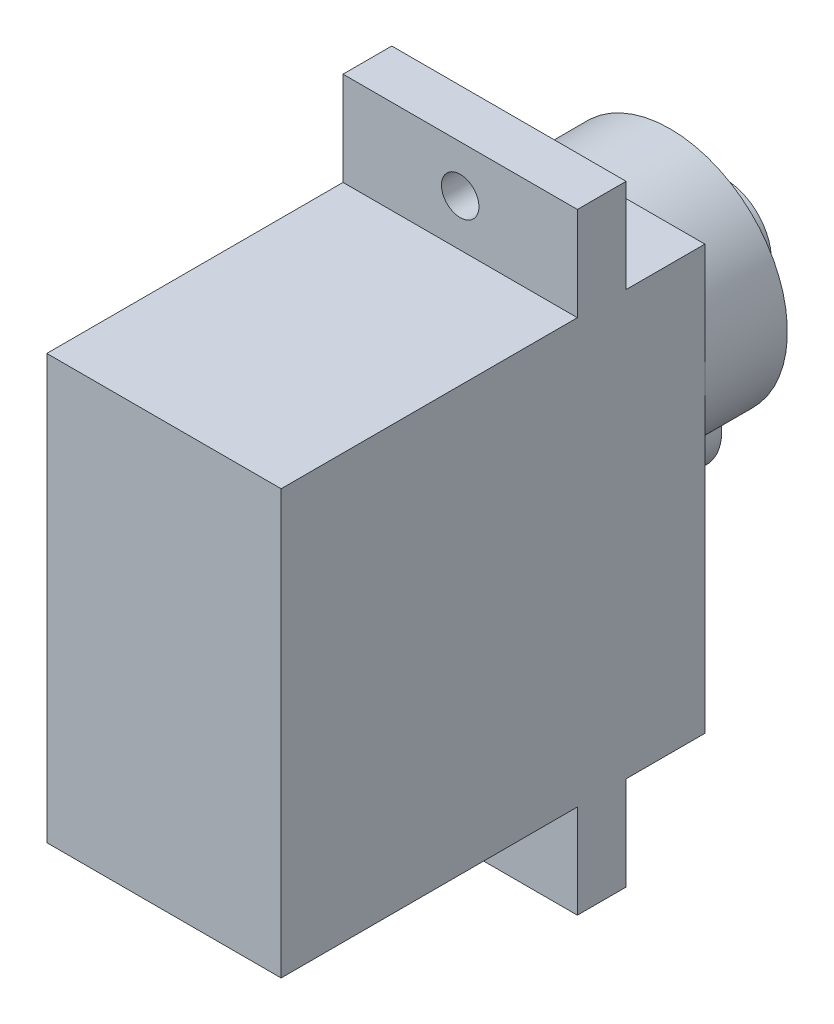
ISO-10303-21;
HEADER;
FILE_DESCRIPTION(('STEP AP214'),'2;1');
FILE_NAME('part.step','',(''),(''),'','','');
FILE_SCHEMA(('AUTOMOTIVE_DESIGN { 1 0 10303 214 1 1 1 1 }'));
ENDSEC;
DATA;
#1=APPLICATION_CONTEXT('core data for automotive mechanical design processes');
#2=APPLICATION_PROTOCOL_DEFINITION('international standard','automotive_design',2000,#1);
#3=PRODUCT_CONTEXT('',#1,'mechanical');
#4=PRODUCT('Part','Part','',(#3));
#5=PRODUCT_RELATED_PRODUCT_CATEGORY('part','',(#4));
#6=PRODUCT_DEFINITION_FORMATION('','',#4);
#7=PRODUCT_DEFINITION_CONTEXT('part definition',#1,'design');
#8=PRODUCT_DEFINITION('design','',#6,#7);
#9=PRODUCT_DEFINITION_SHAPE('','',#8);
#10=(LENGTH_UNIT() NAMED_UNIT(*) SI_UNIT(.MILLI.,.METRE.));
#11=(NAMED_UNIT(*) PLANE_ANGLE_UNIT() SI_UNIT($,.RADIAN.));
#12=(NAMED_UNIT(*) SI_UNIT($,.STERADIAN.) SOLID_ANGLE_UNIT());
#13=UNCERTAINTY_MEASURE_WITH_UNIT(LENGTH_MEASURE(1.E-05),#10,'distance_accuracy_value','');
#14=(GEOMETRIC_REPRESENTATION_CONTEXT(3) GLOBAL_UNCERTAINTY_ASSIGNED_CONTEXT((#13)) GLOBAL_UNIT_ASSIGNED_CONTEXT((#10,
#11,#12)) REPRESENTATION_CONTEXT('',''));
#15=CARTESIAN_POINT('',(0.,0.,0.));
#16=DIRECTION('',(0.,0.,1.));
#17=DIRECTION('',(1.,0.,0.));
#18=AXIS2_PLACEMENT_3D('',#15,#16,#17);
#19=CARTESIAN_POINT('',(6.25,18.175,-11.2));
#20=DIRECTION('',(0.,0.,-1.));
#21=DIRECTION('',(0.,1.,0.));
#22=AXIS2_PLACEMENT_3D('',#19,#20,#21);
#23=PLANE('',#22);
#24=CARTESIAN_POINT('',(6.25,15.,-11.2));
#25=DIRECTION('',(0.,0.,-1.));
#26=DIRECTION('',(0.,1.,0.));
#27=AXIS2_PLACEMENT_3D('',#24,#25,#26);
#28=CIRCLE('',#27,2.75);
#29=CARTESIAN_POINT('',(8.9108105336674,15.6946850393701,-11.2));
#30=VERTEX_POINT('',#29);
#31=CARTESIAN_POINT('',(3.5891894663326,15.6946850393701,-11.2));
#32=VERTEX_POINT('',#31);
#33=EDGE_CURVE('E168',#30,#32,#28,.T.);
#34=ORIENTED_EDGE('',*,*,#33,.T.);
#35=CARTESIAN_POINT('',(6.25,21.35,-11.2));
#36=DIRECTION('',(0.,0.,-1.));
#37=DIRECTION('',(0.,-1.,0.));
#38=AXIS2_PLACEMENT_3D('',#35,#36,#37);
#39=CIRCLE('',#38,6.25);
#40=EDGE_CURVE('E158',#32,#30,#39,.T.);
#41=ORIENTED_EDGE('',*,*,#40,.T.);
#42=EDGE_LOOP('',(#34,#41));
#43=FACE_BOUND('',#42,.T.);
#44=CARTESIAN_POINT('',(6.25,21.35,-11.2));
#45=DIRECTION('',(0.,0.,-1.));
#46=DIRECTION('',(0.,1.,0.));
#47=AXIS2_PLACEMENT_3D('',#44,#45,#46);
#48=CIRCLE('',#47,2.5);
#49=CARTESIAN_POINT('',(6.25,23.85,-11.2));
#50=VERTEX_POINT('',#49);
#51=EDGE_CURVE('E269',#50,#50,#48,.T.);
#52=ORIENTED_EDGE('',*,*,#51,.F.);
#53=EDGE_LOOP('',(#52));
#54=FACE_BOUND('',#53,.T.);
#55=ADVANCED_FACE('F46',(#43,#54),#23,.T.);
#56=CARTESIAN_POINT('',(12.5,27.6,-6.8));
#57=DIRECTION('',(0.,0.,1.));
#58=DIRECTION('',(0.,-1.,0.));
#59=AXIS2_PLACEMENT_3D('',#56,#57,#58);
#60=PLANE('',#59);
#61=CARTESIAN_POINT('',(6.25,15.,-6.80000000000001));
#62=DIRECTION('',(0.,0.,-1.));
#63=DIRECTION('',(0.,1.,0.));
#64=AXIS2_PLACEMENT_3D('',#61,#62,#63);
#65=CIRCLE('',#64,2.75);
#66=CARTESIAN_POINT('',(8.9108105336674,15.6946850393701,-6.80000000000001));
#67=VERTEX_POINT('',#66);
#68=CARTESIAN_POINT('',(3.5891894663326,15.6946850393701,-6.80000000000001));
#69=VERTEX_POINT('',#68);
#70=EDGE_CURVE('E174',#67,#69,#65,.T.);
#71=ORIENTED_EDGE('',*,*,#70,.F.);
#72=CARTESIAN_POINT('',(6.25,21.35,-6.80000000000001));
#73=DIRECTION('',(0.,0.,-1.));
#74=DIRECTION('',(0.,-1.,0.));
#75=AXIS2_PLACEMENT_3D('',#72,#73,#74);
#76=CIRCLE('',#75,6.25);
#77=CARTESIAN_POINT('',(12.5,21.35,-6.80000000000001));
#78=VERTEX_POINT('',#77);
#79=EDGE_CURVE('E69',#78,#67,#76,.T.);
#80=ORIENTED_EDGE('',*,*,#79,.F.);
#81=DIRECTION('',(0.,1.,0.));
#82=VECTOR('',#81,1.);
#83=CARTESIAN_POINT('',(12.5,27.6,-6.8));
#84=LINE('',#83,#82);
#85=CARTESIAN_POINT('',(12.5,5.,-6.80000000000001));
#86=VERTEX_POINT('',#85);
#87=EDGE_CURVE('E191',#86,#78,#84,.T.);
#88=ORIENTED_EDGE('',*,*,#87,.F.);
#89=DIRECTION('',(-1.,0.,0.));
#90=VECTOR('',#89,1.);
#91=CARTESIAN_POINT('',(12.5,5.,-6.80000000000001));
#92=LINE('',#91,#90);
#93=CARTESIAN_POINT('',(0.,5.,-6.80000000000001));
#94=VERTEX_POINT('',#93);
#95=EDGE_CURVE('E259',#86,#94,#92,.T.);
#96=ORIENTED_EDGE('',*,*,#95,.T.);
#97=DIRECTION('',(0.,1.,0.));
#98=VECTOR('',#97,1.);
#99=CARTESIAN_POINT('',(0.,27.6,-6.8));
#100=LINE('',#99,#98);
#101=CARTESIAN_POINT('',(0.,21.35,-6.80000000000001));
#102=VERTEX_POINT('',#101);
#103=EDGE_CURVE('E215',#94,#102,#100,.T.);
#104=ORIENTED_EDGE('',*,*,#103,.T.);
#105=EDGE_CURVE('E57',#69,#102,#76,.T.);
#106=ORIENTED_EDGE('',*,*,#105,.F.);
#107=EDGE_LOOP('',(#71,#80,#88,#96,#104,#106));
#108=FACE_BOUND('',#107,.T.);
#109=ADVANCED_FACE('F306',(#108),#60,.F.);
#110=CARTESIAN_POINT('',(6.25,27.6,-6.8));
#111=VERTEX_POINT('',#110);
#112=EDGE_CURVE('E13',#102,#111,#76,.T.);
#113=ORIENTED_EDGE('',*,*,#112,.F.);
#114=CARTESIAN_POINT('',(0.,27.6,-6.8));
#115=VERTEX_POINT('',#114);
#116=EDGE_CURVE('E214',#102,#115,#100,.T.);
#117=ORIENTED_EDGE('',*,*,#116,.T.);
#118=DIRECTION('',(-1.,0.,0.));
#119=VECTOR('',#118,1.);
#120=CARTESIAN_POINT('',(12.5,27.6,-6.8));
#121=LINE('',#120,#119);
#122=EDGE_CURVE('E255',#111,#115,#121,.T.);
#123=ORIENTED_EDGE('',*,*,#122,.F.);
#124=EDGE_LOOP('',(#113,#117,#123));
#125=FACE_BOUND('',#124,.T.);
#126=ADVANCED_FACE('F294',(#125),#60,.F.);
#127=EDGE_CURVE('E55',#111,#78,#76,.T.);
#128=ORIENTED_EDGE('',*,*,#127,.F.);
#129=CARTESIAN_POINT('',(12.5,27.6,-6.8));
#130=VERTEX_POINT('',#129);
#131=EDGE_CURVE('E256',#130,#111,#121,.T.);
#132=ORIENTED_EDGE('',*,*,#131,.F.);
#133=EDGE_CURVE('E190',#78,#130,#84,.T.);
#134=ORIENTED_EDGE('',*,*,#133,.F.);
#135=EDGE_LOOP('',(#128,#132,#134));
#136=FACE_BOUND('',#135,.T.);
#137=ADVANCED_FACE('F290',(#136),#60,.F.);
#138=CARTESIAN_POINT('',(12.5,0.,-2.6));
#139=DIRECTION('',(0.,1.,0.));
#140=DIRECTION('',(0.,0.,1.));
#141=AXIS2_PLACEMENT_3D('',#138,#139,#140);
#142=PLANE('',#141);
#143=DIRECTION('',(0.,0.,-1.));
#144=VECTOR('',#143,1.);
#145=CARTESIAN_POINT('',(0.,0.,-2.6));
#146=LINE('',#145,#144);
#147=CARTESIAN_POINT('',(0.,0.,0.));
#148=VERTEX_POINT('',#147);
#149=CARTESIAN_POINT('',(0.,0.,-2.6));
#150=VERTEX_POINT('',#149);
#151=EDGE_CURVE('E175',#148,#150,#146,.T.);
#152=ORIENTED_EDGE('',*,*,#151,.T.);
#153=DIRECTION('',(-1.,0.,0.));
#154=VECTOR('',#153,1.);
#155=CARTESIAN_POINT('',(12.5,0.,-2.6));
#156=LINE('',#155,#154);
#157=CARTESIAN_POINT('',(12.5,0.,-2.6));
#158=VERTEX_POINT('',#157);
#159=EDGE_CURVE('E265',#158,#150,#156,.T.);
#160=ORIENTED_EDGE('',*,*,#159,.F.);
#161=DIRECTION('',(0.,0.,-1.));
#162=VECTOR('',#161,1.);
#163=CARTESIAN_POINT('',(12.5,0.,-2.6));
#164=LINE('',#163,#162);
#165=CARTESIAN_POINT('',(12.5,0.,0.));
#166=VERTEX_POINT('',#165);
#167=EDGE_CURVE('E182',#166,#158,#164,.T.);
#168=ORIENTED_EDGE('',*,*,#167,.F.);
#169=DIRECTION('',(-1.,0.,0.));
#170=VECTOR('',#169,1.);
#171=CARTESIAN_POINT('',(12.5,0.,0.));
#172=LINE('',#171,#170);
#173=EDGE_CURVE('E209',#166,#148,#172,.T.);
#174=ORIENTED_EDGE('',*,*,#173,.T.);
#175=EDGE_LOOP('',(#152,#160,#168,#174));
#176=FACE_BOUND('',#175,.T.);
#177=ADVANCED_FACE('F48',(#176),#142,.F.);
#178=CARTESIAN_POINT('',(12.5,5.,-2.6));
#179=DIRECTION('',(0.,0.,1.));
#180=DIRECTION('',(0.,-1.,0.));
#181=AXIS2_PLACEMENT_3D('',#178,#179,#180);
#182=PLANE('',#181);
#183=CARTESIAN_POINT('',(6.25,2.49999999999999,-2.60000000000002));
#184=DIRECTION('',(0.,0.,-1.));
#185=DIRECTION('',(0.,1.,0.));
#186=AXIS2_PLACEMENT_3D('',#183,#184,#185);
#187=CIRCLE('',#186,1.);
#188=CARTESIAN_POINT('',(6.25,3.49999999999999,-2.60000000000002));
#189=VERTEX_POINT('',#188);
#190=EDGE_CURVE('E281',#189,#189,#187,.T.);
#191=ORIENTED_EDGE('',*,*,#190,.F.);
#192=EDGE_LOOP('',(#191));
#193=FACE_BOUND('',#192,.T.);
#194=DIRECTION('',(0.,1.,0.));
#195=VECTOR('',#194,1.);
#196=CARTESIAN_POINT('',(0.,5.,-2.6));
#197=LINE('',#196,#195);
#198=CARTESIAN_POINT('',(0.,5.,-2.6));
#199=VERTEX_POINT('',#198);
#200=EDGE_CURVE('E178',#150,#199,#197,.T.);
#201=ORIENTED_EDGE('',*,*,#200,.T.);
#202=DIRECTION('',(-1.,0.,0.));
#203=VECTOR('',#202,1.);
#204=CARTESIAN_POINT('',(12.5,5.,-2.6));
#205=LINE('',#204,#203);
#206=CARTESIAN_POINT('',(12.5,5.,-2.6));
#207=VERTEX_POINT('',#206);
#208=EDGE_CURVE('E262',#207,#199,#205,.T.);
#209=ORIENTED_EDGE('',*,*,#208,.F.);
#210=DIRECTION('',(0.,1.,0.));
#211=VECTOR('',#210,1.);
#212=CARTESIAN_POINT('',(12.5,5.,-2.6));
#213=LINE('',#212,#211);
#214=EDGE_CURVE('E185',#158,#207,#213,.T.);
#215=ORIENTED_EDGE('',*,*,#214,.F.);
#216=ORIENTED_EDGE('',*,*,#159,.T.);
#217=EDGE_LOOP('',(#201,#209,#215,#216));
#218=FACE_BOUND('',#217,.T.);
#219=ADVANCED_FACE('F351',(#193,#218),#182,.F.);
#220=CARTESIAN_POINT('',(12.5,5.,-6.80000000000001));
#221=DIRECTION('',(0.,1.,0.));
#222=DIRECTION('',(0.,0.,1.));
#223=AXIS2_PLACEMENT_3D('',#220,#221,#222);
#224=PLANE('',#223);
#225=DIRECTION('',(0.,0.,-1.));
#226=VECTOR('',#225,1.);
#227=CARTESIAN_POINT('',(0.,5.,-6.80000000000001));
#228=LINE('',#227,#226);
#229=EDGE_CURVE('E212',#199,#94,#228,.T.);
#230=ORIENTED_EDGE('',*,*,#229,.T.);
#231=ORIENTED_EDGE('',*,*,#95,.F.);
#232=DIRECTION('',(0.,0.,-1.));
#233=VECTOR('',#232,1.);
#234=CARTESIAN_POINT('',(12.5,5.,-6.80000000000001));
#235=LINE('',#234,#233);
#236=EDGE_CURVE('E188',#207,#86,#235,.T.);
#237=ORIENTED_EDGE('',*,*,#236,.F.);
#238=ORIENTED_EDGE('',*,*,#208,.T.);
#239=EDGE_LOOP('',(#230,#231,#237,#238));
#240=FACE_BOUND('',#239,.T.);
#241=ADVANCED_FACE('F352',(#240),#224,.F.);
#242=CARTESIAN_POINT('',(12.5,27.6,-2.6));
#243=DIRECTION('',(0.,-1.,0.));
#244=DIRECTION('',(0.,0.,-1.));
#245=AXIS2_PLACEMENT_3D('',#242,#243,#244);
#246=PLANE('',#245);
#247=DIRECTION('',(0.,0.,1.));
#248=VECTOR('',#247,1.);
#249=CARTESIAN_POINT('',(0.,27.6,-2.6));
#250=LINE('',#249,#248);
#251=CARTESIAN_POINT('',(0.,27.6,-2.6));
#252=VERTEX_POINT('',#251);
#253=EDGE_CURVE('E217',#115,#252,#250,.T.);
#254=ORIENTED_EDGE('',*,*,#253,.T.);
#255=DIRECTION('',(-1.,0.,0.));
#256=VECTOR('',#255,1.);
#257=CARTESIAN_POINT('',(12.5,27.6,-2.6));
#258=LINE('',#257,#256);
#259=CARTESIAN_POINT('',(12.5,27.6,-2.6));
#260=VERTEX_POINT('',#259);
#261=EDGE_CURVE('E252',#260,#252,#258,.T.);
#262=ORIENTED_EDGE('',*,*,#261,.F.);
#263=DIRECTION('',(0.,0.,1.));
#264=VECTOR('',#263,1.);
#265=CARTESIAN_POINT('',(12.5,27.6,-2.6));
#266=LINE('',#265,#264);
#267=EDGE_CURVE('E194',#130,#260,#266,.T.);
#268=ORIENTED_EDGE('',*,*,#267,.F.);
#269=ORIENTED_EDGE('',*,*,#131,.T.);
#270=ORIENTED_EDGE('',*,*,#122,.T.);
#271=EDGE_LOOP('',(#254,#262,#268,#269,#270));
#272=FACE_BOUND('',#271,.T.);
#273=ADVANCED_FACE('F298',(#272),#246,.F.);
#274=CARTESIAN_POINT('',(12.5,32.6,-2.6));
#275=DIRECTION('',(0.,0.,1.));
#276=DIRECTION('',(0.,-1.,0.));
#277=AXIS2_PLACEMENT_3D('',#274,#275,#276);
#278=PLANE('',#277);
#279=CARTESIAN_POINT('',(6.25,30.1,-2.6));
#280=DIRECTION('',(0.,0.,-1.));
#281=DIRECTION('',(0.,1.,0.));
#282=AXIS2_PLACEMENT_3D('',#279,#280,#281);
#283=CIRCLE('',#282,1.);
#284=CARTESIAN_POINT('',(6.25,31.1,-2.6));
#285=VERTEX_POINT('',#284);
#286=EDGE_CURVE('E270',#285,#285,#283,.T.);
#287=ORIENTED_EDGE('',*,*,#286,.F.);
#288=EDGE_LOOP('',(#287));
#289=FACE_BOUND('',#288,.T.);
#290=DIRECTION('',(0.,1.,0.));
#291=VECTOR('',#290,1.);
#292=CARTESIAN_POINT('',(0.,32.6,-2.6));
#293=LINE('',#292,#291);
#294=CARTESIAN_POINT('',(0.,32.6,-2.6));
#295=VERTEX_POINT('',#294);
#296=EDGE_CURVE('E219',#252,#295,#293,.T.);
#297=ORIENTED_EDGE('',*,*,#296,.T.);
#298=DIRECTION('',(-1.,0.,0.));
#299=VECTOR('',#298,1.);
#300=CARTESIAN_POINT('',(12.5,32.6,-2.6));
#301=LINE('',#300,#299);
#302=CARTESIAN_POINT('',(12.5,32.6,-2.6));
#303=VERTEX_POINT('',#302);
#304=EDGE_CURVE('E249',#303,#295,#301,.T.);
#305=ORIENTED_EDGE('',*,*,#304,.F.);
#306=DIRECTION('',(0.,1.,0.));
#307=VECTOR('',#306,1.);
#308=CARTESIAN_POINT('',(12.5,32.6,-2.6));
#309=LINE('',#308,#307);
#310=EDGE_CURVE('E196',#260,#303,#309,.T.);
#311=ORIENTED_EDGE('',*,*,#310,.F.);
#312=ORIENTED_EDGE('',*,*,#261,.T.);
#313=EDGE_LOOP('',(#297,#305,#311,#312));
#314=FACE_BOUND('',#313,.T.);
#315=ADVANCED_FACE('F316',(#289,#314),#278,.F.);
#316=CARTESIAN_POINT('',(12.5,32.6,0.));
#317=DIRECTION('',(0.,-1.,0.));
#318=DIRECTION('',(0.,0.,-1.));
#319=AXIS2_PLACEMENT_3D('',#316,#317,#318);
#320=PLANE('',#319);
#321=DIRECTION('',(0.,0.,1.));
#322=VECTOR('',#321,1.);
#323=CARTESIAN_POINT('',(0.,32.6,0.));
#324=LINE('',#323,#322);
#325=CARTESIAN_POINT('',(0.,32.6,0.));
#326=VERTEX_POINT('',#325);
#327=EDGE_CURVE('E221',#295,#326,#324,.T.);
#328=ORIENTED_EDGE('',*,*,#327,.T.);
#329=DIRECTION('',(-1.,0.,0.));
#330=VECTOR('',#329,1.);
#331=CARTESIAN_POINT('',(12.5,32.6,0.));
#332=LINE('',#331,#330);
#333=CARTESIAN_POINT('',(12.5,32.6,0.));
#334=VERTEX_POINT('',#333);
#335=EDGE_CURVE('E246',#334,#326,#332,.T.);
#336=ORIENTED_EDGE('',*,*,#335,.F.);
#337=DIRECTION('',(0.,0.,1.));
#338=VECTOR('',#337,1.);
#339=CARTESIAN_POINT('',(12.5,32.6,0.));
#340=LINE('',#339,#338);
#341=EDGE_CURVE('E198',#303,#334,#340,.T.);
#342=ORIENTED_EDGE('',*,*,#341,.F.);
#343=ORIENTED_EDGE('',*,*,#304,.T.);
#344=EDGE_LOOP('',(#328,#336,#342,#343));
#345=FACE_BOUND('',#344,.T.);
#346=ADVANCED_FACE('F320',(#345),#320,.F.);
#347=CARTESIAN_POINT('',(12.5,27.6,0.));
#348=DIRECTION('',(0.,0.,-1.));
#349=DIRECTION('',(-1.,0.,0.));
#350=AXIS2_PLACEMENT_3D('',#347,#348,#349);
#351=PLANE('',#350);
#352=CARTESIAN_POINT('',(6.25,30.1,0.));
#353=DIRECTION('',(0.,0.,-1.));
#354=DIRECTION('',(-1.,0.,0.));
#355=AXIS2_PLACEMENT_3D('',#352,#353,#354);
#356=CIRCLE('',#355,1.);
#357=CARTESIAN_POINT('',(5.25,30.1,0.));
#358=VERTEX_POINT('',#357);
#359=EDGE_CURVE('E267',#358,#358,#356,.T.);
#360=ORIENTED_EDGE('',*,*,#359,.T.);
#361=EDGE_LOOP('',(#360));
#362=FACE_BOUND('',#361,.T.);
#363=DIRECTION('',(0.,-1.,0.));
#364=VECTOR('',#363,1.);
#365=CARTESIAN_POINT('',(0.,27.6,0.));
#366=LINE('',#365,#364);
#367=CARTESIAN_POINT('',(0.,27.6,0.));
#368=VERTEX_POINT('',#367);
#369=EDGE_CURVE('E223',#326,#368,#366,.T.);
#370=ORIENTED_EDGE('',*,*,#369,.T.);
#371=DIRECTION('',(-1.,0.,0.));
#372=VECTOR('',#371,1.);
#373=CARTESIAN_POINT('',(12.5,27.6,0.));
#374=LINE('',#373,#372);
#375=CARTESIAN_POINT('',(12.5,27.6,0.));
#376=VERTEX_POINT('',#375);
#377=EDGE_CURVE('E243',#376,#368,#374,.T.);
#378=ORIENTED_EDGE('',*,*,#377,.F.);
#379=DIRECTION('',(0.,-1.,0.));
#380=VECTOR('',#379,1.);
#381=CARTESIAN_POINT('',(12.5,27.6,0.));
#382=LINE('',#381,#380);
#383=EDGE_CURVE('E200',#334,#376,#382,.T.);
#384=ORIENTED_EDGE('',*,*,#383,.F.);
#385=ORIENTED_EDGE('',*,*,#335,.T.);
#386=EDGE_LOOP('',(#370,#378,#384,#385));
#387=FACE_BOUND('',#386,.T.);
#388=ADVANCED_FACE('F326',(#362,#387),#351,.F.);
#389=CARTESIAN_POINT('',(12.5,27.6,15.8));
#390=DIRECTION('',(0.,-1.,0.));
#391=DIRECTION('',(0.,0.,-1.));
#392=AXIS2_PLACEMENT_3D('',#389,#390,#391);
#393=PLANE('',#392);
#394=DIRECTION('',(0.,0.,1.));
#395=VECTOR('',#394,1.);
#396=CARTESIAN_POINT('',(0.,27.6,15.8));
#397=LINE('',#396,#395);
#398=CARTESIAN_POINT('',(0.,27.6,15.8));
#399=VERTEX_POINT('',#398);
#400=EDGE_CURVE('E225',#368,#399,#397,.T.);
#401=ORIENTED_EDGE('',*,*,#400,.T.);
#402=DIRECTION('',(-1.,0.,0.));
#403=VECTOR('',#402,1.);
#404=CARTESIAN_POINT('',(12.5,27.6,15.8));
#405=LINE('',#404,#403);
#406=CARTESIAN_POINT('',(12.5,27.6,15.8));
#407=VERTEX_POINT('',#406);
#408=EDGE_CURVE('E240',#407,#399,#405,.T.);
#409=ORIENTED_EDGE('',*,*,#408,.F.);
#410=DIRECTION('',(0.,0.,1.));
#411=VECTOR('',#410,1.);
#412=CARTESIAN_POINT('',(12.5,27.6,15.8));
#413=LINE('',#412,#411);
#414=EDGE_CURVE('E202',#376,#407,#413,.T.);
#415=ORIENTED_EDGE('',*,*,#414,.F.);
#416=ORIENTED_EDGE('',*,*,#377,.T.);
#417=EDGE_LOOP('',(#401,#409,#415,#416));
#418=FACE_BOUND('',#417,.T.);
#419=ADVANCED_FACE('F330',(#418),#393,.F.);
#420=CARTESIAN_POINT('',(12.5,5.,15.8));
#421=DIRECTION('',(0.,0.,-1.));
#422=DIRECTION('',(-1.,0.,0.));
#423=AXIS2_PLACEMENT_3D('',#420,#421,#422);
#424=PLANE('',#423);
#425=DIRECTION('',(0.,-1.,0.));
#426=VECTOR('',#425,1.);
#427=CARTESIAN_POINT('',(0.,5.,15.8));
#428=LINE('',#427,#426);
#429=CARTESIAN_POINT('',(0.,5.,15.8));
#430=VERTEX_POINT('',#429);
#431=EDGE_CURVE('E227',#399,#430,#428,.T.);
#432=ORIENTED_EDGE('',*,*,#431,.T.);
#433=DIRECTION('',(-1.,0.,0.));
#434=VECTOR('',#433,1.);
#435=CARTESIAN_POINT('',(12.5,5.,15.8));
#436=LINE('',#435,#434);
#437=CARTESIAN_POINT('',(12.5,5.,15.8));
#438=VERTEX_POINT('',#437);
#439=EDGE_CURVE('E237',#438,#430,#436,.T.);
#440=ORIENTED_EDGE('',*,*,#439,.F.);
#441=DIRECTION('',(0.,-1.,0.));
#442=VECTOR('',#441,1.);
#443=CARTESIAN_POINT('',(12.5,5.,15.8));
#444=LINE('',#443,#442);
#445=EDGE_CURVE('E204',#407,#438,#444,.T.);
#446=ORIENTED_EDGE('',*,*,#445,.F.);
#447=ORIENTED_EDGE('',*,*,#408,.T.);
#448=EDGE_LOOP('',(#432,#440,#446,#447));
#449=FACE_BOUND('',#448,.T.);
#450=ADVANCED_FACE('F335',(#449),#424,.F.);
#451=CARTESIAN_POINT('',(12.5,5.,0.));
#452=DIRECTION('',(0.,1.,0.));
#453=DIRECTION('',(0.,0.,1.));
#454=AXIS2_PLACEMENT_3D('',#451,#452,#453);
#455=PLANE('',#454);
#456=DIRECTION('',(0.,0.,-1.));
#457=VECTOR('',#456,1.);
#458=CARTESIAN_POINT('',(0.,5.,0.));
#459=LINE('',#458,#457);
#460=CARTESIAN_POINT('',(0.,5.,0.));
#461=VERTEX_POINT('',#460);
#462=EDGE_CURVE('E229',#430,#461,#459,.T.);
#463=ORIENTED_EDGE('',*,*,#462,.T.);
#464=DIRECTION('',(-1.,0.,0.));
#465=VECTOR('',#464,1.);
#466=CARTESIAN_POINT('',(12.5,5.,0.));
#467=LINE('',#466,#465);
#468=CARTESIAN_POINT('',(12.5,5.,0.));
#469=VERTEX_POINT('',#468);
#470=EDGE_CURVE('E234',#469,#461,#467,.T.);
#471=ORIENTED_EDGE('',*,*,#470,.F.);
#472=DIRECTION('',(0.,0.,-1.));
#473=VECTOR('',#472,1.);
#474=CARTESIAN_POINT('',(12.5,5.,0.));
#475=LINE('',#474,#473);
#476=EDGE_CURVE('E206',#438,#469,#475,.T.);
#477=ORIENTED_EDGE('',*,*,#476,.F.);
#478=ORIENTED_EDGE('',*,*,#439,.T.);
#479=EDGE_LOOP('',(#463,#471,#477,#478));
#480=FACE_BOUND('',#479,.T.);
#481=ADVANCED_FACE('F341',(#480),#455,.F.);
#482=CARTESIAN_POINT('',(12.5,0.,0.));
#483=DIRECTION('',(0.,0.,-1.));
#484=DIRECTION('',(-1.,0.,0.));
#485=AXIS2_PLACEMENT_3D('',#482,#483,#484);
#486=PLANE('',#485);
#487=CARTESIAN_POINT('',(6.25,2.49999999999999,0.));
#488=DIRECTION('',(0.,0.,-1.));
#489=DIRECTION('',(-1.,0.,0.));
#490=AXIS2_PLACEMENT_3D('',#487,#488,#489);
#491=CIRCLE('',#490,1.);
#492=CARTESIAN_POINT('',(5.25,2.49999999999999,0.));
#493=VERTEX_POINT('',#492);
#494=EDGE_CURVE('E50',#493,#493,#491,.T.);
#495=ORIENTED_EDGE('',*,*,#494,.T.);
#496=EDGE_LOOP('',(#495));
#497=FACE_BOUND('',#496,.T.);
#498=DIRECTION('',(0.,-1.,0.));
#499=VECTOR('',#498,1.);
#500=CARTESIAN_POINT('',(0.,0.,0.));
#501=LINE('',#500,#499);
#502=EDGE_CURVE('E186',#461,#148,#501,.T.);
#503=ORIENTED_EDGE('',*,*,#502,.T.);
#504=ORIENTED_EDGE('',*,*,#173,.F.);
#505=DIRECTION('',(0.,-1.,0.));
#506=VECTOR('',#505,1.);
#507=CARTESIAN_POINT('',(12.5,0.,0.));
#508=LINE('',#507,#506);
#509=EDGE_CURVE('E208',#469,#166,#508,.T.);
#510=ORIENTED_EDGE('',*,*,#509,.F.);
#511=ORIENTED_EDGE('',*,*,#470,.T.);
#512=EDGE_LOOP('',(#503,#504,#510,#511));
#513=FACE_BOUND('',#512,.T.);
#514=ADVANCED_FACE('F345',(#497,#513),#486,.F.);
#515=CARTESIAN_POINT('',(12.5,0.,0.));
#516=DIRECTION('',(-1.,0.,0.));
#517=DIRECTION('',(0.,0.,1.));
#518=AXIS2_PLACEMENT_3D('',#515,#516,#517);
#519=PLANE('',#518);
#520=ORIENTED_EDGE('',*,*,#167,.T.);
#521=ORIENTED_EDGE('',*,*,#214,.T.);
#522=ORIENTED_EDGE('',*,*,#236,.T.);
#523=ORIENTED_EDGE('',*,*,#87,.T.);
#524=ORIENTED_EDGE('',*,*,#133,.T.);
#525=ORIENTED_EDGE('',*,*,#267,.T.);
#526=ORIENTED_EDGE('',*,*,#310,.T.);
#527=ORIENTED_EDGE('',*,*,#341,.T.);
#528=ORIENTED_EDGE('',*,*,#383,.T.);
#529=ORIENTED_EDGE('',*,*,#414,.T.);
#530=ORIENTED_EDGE('',*,*,#445,.T.);
#531=ORIENTED_EDGE('',*,*,#476,.T.);
#532=ORIENTED_EDGE('',*,*,#509,.T.);
#533=EDGE_LOOP('',(#520,#521,#522,#523,#524,#525,#526,#527,#528,#529,#530,#531,#532));
#534=FACE_BOUND('',#533,.T.);
#535=ADVANCED_FACE('F302',(#534),#519,.F.);
#536=CARTESIAN_POINT('',(0.,0.,0.));
#537=DIRECTION('',(-1.,0.,0.));
#538=DIRECTION('',(0.,0.,1.));
#539=AXIS2_PLACEMENT_3D('',#536,#537,#538);
#540=PLANE('',#539);
#541=ORIENTED_EDGE('',*,*,#151,.F.);
#542=ORIENTED_EDGE('',*,*,#502,.F.);
#543=ORIENTED_EDGE('',*,*,#462,.F.);
#544=ORIENTED_EDGE('',*,*,#431,.F.);
#545=ORIENTED_EDGE('',*,*,#400,.F.);
#546=ORIENTED_EDGE('',*,*,#369,.F.);
#547=ORIENTED_EDGE('',*,*,#327,.F.);
#548=ORIENTED_EDGE('',*,*,#296,.F.);
#549=ORIENTED_EDGE('',*,*,#253,.F.);
#550=ORIENTED_EDGE('',*,*,#116,.F.);
#551=ORIENTED_EDGE('',*,*,#103,.F.);
#552=ORIENTED_EDGE('',*,*,#229,.F.);
#553=ORIENTED_EDGE('',*,*,#200,.F.);
#554=EDGE_LOOP('',(#541,#542,#543,#544,#545,#546,#547,#548,#549,#550,#551,#552,#553));
#555=FACE_BOUND('',#554,.T.);
#556=ADVANCED_FACE('F312',(#555),#540,.T.);
#557=CARTESIAN_POINT('',(6.25,15.,-11.2));
#558=DIRECTION('',(0.,0.,1.));
#559=DIRECTION('',(0.,-1.,0.));
#560=AXIS2_PLACEMENT_3D('',#557,#558,#559);
#561=CYLINDRICAL_SURFACE('',#560,2.75);
#562=ORIENTED_EDGE('',*,*,#70,.T.);
#563=DIRECTION('',(0.,0.,1.));
#564=VECTOR('',#563,1.);
#565=CARTESIAN_POINT('',(3.5891894663326,15.6946850393701,-11.2));
#566=LINE('',#565,#564);
#567=EDGE_CURVE('E162',#32,#69,#566,.T.);
#568=ORIENTED_EDGE('',*,*,#567,.F.);
#569=ORIENTED_EDGE('',*,*,#33,.F.);
#570=DIRECTION('',(0.,0.,1.));
#571=VECTOR('',#570,1.);
#572=CARTESIAN_POINT('',(8.9108105336674,15.6946850393701,-11.2));
#573=LINE('',#572,#571);
#574=EDGE_CURVE('E165',#30,#67,#573,.T.);
#575=ORIENTED_EDGE('',*,*,#574,.T.);
#576=EDGE_LOOP('',(#562,#568,#569,#575));
#577=FACE_BOUND('',#576,.T.);
#578=ADVANCED_FACE('F173',(#577),#561,.T.);
#579=CARTESIAN_POINT('',(6.25,21.35,-11.2));
#580=DIRECTION('',(0.,0.,1.));
#581=DIRECTION('',(0.,-1.,0.));
#582=AXIS2_PLACEMENT_3D('',#579,#580,#581);
#583=CYLINDRICAL_SURFACE('',#582,6.25);
#584=ORIENTED_EDGE('',*,*,#105,.T.);
#585=ORIENTED_EDGE('',*,*,#112,.T.);
#586=ORIENTED_EDGE('',*,*,#127,.T.);
#587=ORIENTED_EDGE('',*,*,#79,.T.);
#588=ORIENTED_EDGE('',*,*,#574,.F.);
#589=ORIENTED_EDGE('',*,*,#40,.F.);
#590=ORIENTED_EDGE('',*,*,#567,.T.);
#591=EDGE_LOOP('',(#584,#585,#586,#587,#588,#589,#590));
#592=FACE_BOUND('',#591,.T.);
#593=ADVANCED_FACE('F160',(#592),#583,.T.);
#594=CARTESIAN_POINT('',(6.25,21.35,-14.1));
#595=DIRECTION('',(0.,0.,1.));
#596=DIRECTION('',(0.,-1.,0.));
#597=AXIS2_PLACEMENT_3D('',#594,#595,#596);
#598=CYLINDRICAL_SURFACE('',#597,2.5);
#599=CARTESIAN_POINT('',(6.25,21.35,-14.1));
#600=DIRECTION('',(0.,0.,-1.));
#601=DIRECTION('',(0.,1.,0.));
#602=AXIS2_PLACEMENT_3D('',#599,#600,#601);
#603=CIRCLE('',#602,2.5);
#604=CARTESIAN_POINT('',(6.25,23.85,-14.1));
#605=VERTEX_POINT('',#604);
#606=EDGE_CURVE('E274',#605,#605,#603,.T.);
#607=ORIENTED_EDGE('',*,*,#606,.F.);
#608=EDGE_LOOP('',(#607));
#609=FACE_BOUND('',#608,.T.);
#610=ORIENTED_EDGE('',*,*,#51,.T.);
#611=EDGE_LOOP('',(#610));
#612=FACE_BOUND('',#611,.T.);
#613=ADVANCED_FACE('F369',(#609,#612),#598,.T.);
#614=CARTESIAN_POINT('',(6.25,21.35,-14.1));
#615=DIRECTION('',(0.,0.,-1.));
#616=DIRECTION('',(0.,1.,0.));
#617=AXIS2_PLACEMENT_3D('',#614,#615,#616);
#618=PLANE('',#617);
#619=ORIENTED_EDGE('',*,*,#606,.T.);
#620=EDGE_LOOP('',(#619));
#621=FACE_BOUND('',#620,.T.);
#622=ADVANCED_FACE('F447',(#621),#618,.T.);
#623=CARTESIAN_POINT('',(6.25,30.1,15.8));
#624=DIRECTION('',(0.,0.,-1.));
#625=DIRECTION('',(0.,1.,0.));
#626=AXIS2_PLACEMENT_3D('',#623,#624,#625);
#627=CYLINDRICAL_SURFACE('',#626,1.);
#628=ORIENTED_EDGE('',*,*,#286,.T.);
#629=EDGE_LOOP('',(#628));
#630=FACE_BOUND('',#629,.T.);
#631=ORIENTED_EDGE('',*,*,#359,.F.);
#632=EDGE_LOOP('',(#631));
#633=FACE_BOUND('',#632,.T.);
#634=ADVANCED_FACE('F454',(#630,#633),#627,.F.);
#635=CARTESIAN_POINT('',(6.25,2.49999999999998,15.8));
#636=DIRECTION('',(0.,0.,-1.));
#637=DIRECTION('',(0.,1.,0.));
#638=AXIS2_PLACEMENT_3D('',#635,#636,#637);
#639=CYLINDRICAL_SURFACE('',#638,1.);
#640=ORIENTED_EDGE('',*,*,#190,.T.);
#641=EDGE_LOOP('',(#640));
#642=FACE_BOUND('',#641,.T.);
#643=ORIENTED_EDGE('',*,*,#494,.F.);
#644=EDGE_LOOP('',(#643));
#645=FACE_BOUND('',#644,.T.);
#646=ADVANCED_FACE('F460',(#642,#645),#639,.F.);
#647=CLOSED_SHELL('',(#55,#109,#126,#137,#177,#219,#241,#273,#315,#346,#388,#419,#450,#481,#514,
#535,#556,#578,#593,#613,#622,#634,#646));
#648=MANIFOLD_SOLID_BREP('B2',#647);
#649=ADVANCED_BREP_SHAPE_REPRESENTATION('',(#18,#648),#14);
#650=SHAPE_DEFINITION_REPRESENTATION(#9,#649);
ENDSEC;
END-ISO-10303-21;
